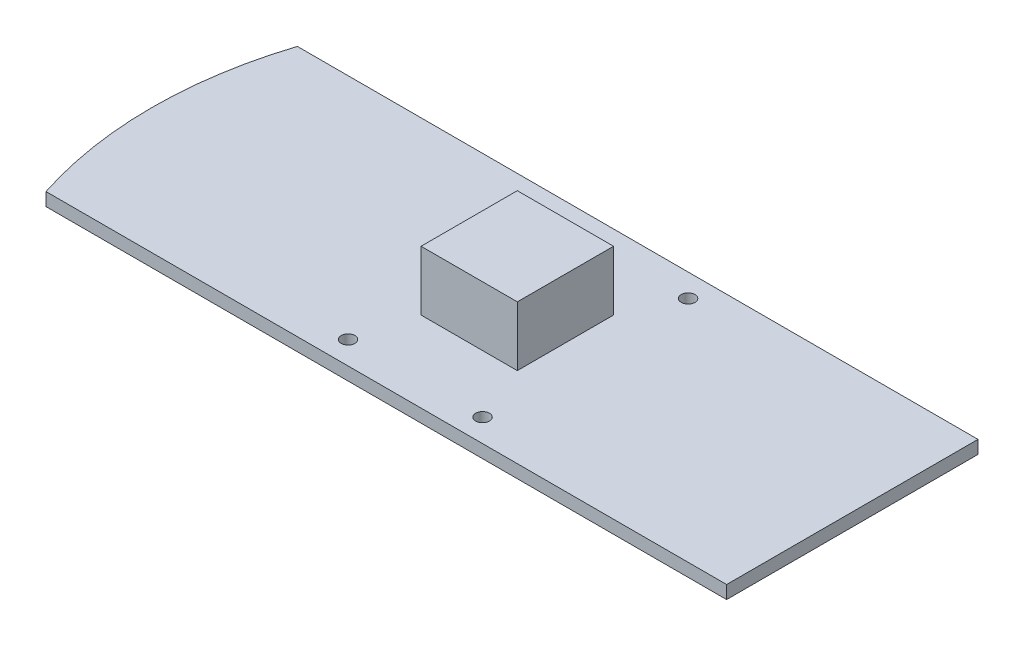
ISO-10303-21;
HEADER;
FILE_DESCRIPTION(('STEP AP214'),'2;1');
FILE_NAME('part.step','',(''),(''),'','','');
FILE_SCHEMA(('AUTOMOTIVE_DESIGN { 1 0 10303 214 1 1 1 1 }'));
ENDSEC;
DATA;
#1=APPLICATION_CONTEXT('core data for automotive mechanical design processes');
#2=APPLICATION_PROTOCOL_DEFINITION('international standard','automotive_design',2000,#1);
#3=PRODUCT_CONTEXT('',#1,'mechanical');
#4=PRODUCT('Part','Part','',(#3));
#5=PRODUCT_RELATED_PRODUCT_CATEGORY('part','',(#4));
#6=PRODUCT_DEFINITION_FORMATION('','',#4);
#7=PRODUCT_DEFINITION_CONTEXT('part definition',#1,'design');
#8=PRODUCT_DEFINITION('design','',#6,#7);
#9=PRODUCT_DEFINITION_SHAPE('','',#8);
#10=(LENGTH_UNIT() NAMED_UNIT(*) SI_UNIT(.MILLI.,.METRE.));
#11=(NAMED_UNIT(*) PLANE_ANGLE_UNIT() SI_UNIT($,.RADIAN.));
#12=(NAMED_UNIT(*) SI_UNIT($,.STERADIAN.) SOLID_ANGLE_UNIT());
#13=UNCERTAINTY_MEASURE_WITH_UNIT(LENGTH_MEASURE(1.E-05),#10,'distance_accuracy_value','');
#14=(GEOMETRIC_REPRESENTATION_CONTEXT(3) GLOBAL_UNCERTAINTY_ASSIGNED_CONTEXT((#13)) GLOBAL_UNIT_ASSIGNED_CONTEXT((#10,
#11,#12)) REPRESENTATION_CONTEXT('',''));
#15=CARTESIAN_POINT('',(0.,0.,0.));
#16=DIRECTION('',(0.,0.,1.));
#17=DIRECTION('',(1.,0.,0.));
#18=AXIS2_PLACEMENT_3D('',#15,#16,#17);
#19=CARTESIAN_POINT('',(0.,2.85,0.));
#20=DIRECTION('',(0.,1.,0.));
#21=DIRECTION('',(0.,0.,1.));
#22=AXIS2_PLACEMENT_3D('',#19,#20,#21);
#23=PLANE('',#22);
#24=CARTESIAN_POINT('',(90.25,2.85,5.));
#25=DIRECTION('',(0.,1.,0.));
#26=DIRECTION('',(0.,0.,1.));
#27=AXIS2_PLACEMENT_3D('',#24,#25,#26);
#28=CIRCLE('',#27,1.5);
#29=CARTESIAN_POINT('',(90.25,2.85,6.5));
#30=VERTEX_POINT('',#29);
#31=EDGE_CURVE('E138',#30,#30,#28,.T.);
#32=ORIENTED_EDGE('',*,*,#31,.F.);
#33=EDGE_LOOP('',(#32));
#34=FACE_BOUND('',#33,.T.);
#35=CARTESIAN_POINT('',(60.9,2.85,5.));
#36=DIRECTION('',(0.,1.,0.));
#37=DIRECTION('',(0.,0.,1.));
#38=AXIS2_PLACEMENT_3D('',#35,#36,#37);
#39=CIRCLE('',#38,1.5);
#40=CARTESIAN_POINT('',(60.9,2.85,6.5));
#41=VERTEX_POINT('',#40);
#42=EDGE_CURVE('E141',#41,#41,#39,.T.);
#43=ORIENTED_EDGE('',*,*,#42,.F.);
#44=EDGE_LOOP('',(#43));
#45=FACE_BOUND('',#44,.T.);
#46=CARTESIAN_POINT('',(60.9,2.85,49.85));
#47=DIRECTION('',(0.,1.,0.));
#48=DIRECTION('',(0.,0.,1.));
#49=AXIS2_PLACEMENT_3D('',#46,#47,#48);
#50=CIRCLE('',#49,1.5);
#51=CARTESIAN_POINT('',(60.9,2.85,51.35));
#52=VERTEX_POINT('',#51);
#53=EDGE_CURVE('E145',#52,#52,#50,.T.);
#54=ORIENTED_EDGE('',*,*,#53,.F.);
#55=EDGE_LOOP('',(#54));
#56=FACE_BOUND('',#55,.T.);
#57=CARTESIAN_POINT('',(90.25,2.85,49.85));
#58=DIRECTION('',(0.,1.,0.));
#59=DIRECTION('',(0.,0.,1.));
#60=AXIS2_PLACEMENT_3D('',#57,#58,#59);
#61=CIRCLE('',#60,1.5);
#62=CARTESIAN_POINT('',(90.25,2.85,51.35));
#63=VERTEX_POINT('',#62);
#64=EDGE_CURVE('E148',#63,#63,#61,.T.);
#65=ORIENTED_EDGE('',*,*,#64,.F.);
#66=EDGE_LOOP('',(#65));
#67=FACE_BOUND('',#66,.T.);
#68=DIRECTION('',(0.,0.,1.));
#69=VECTOR('',#68,1.);
#70=CARTESIAN_POINT('',(148.5,2.85,0.));
#71=LINE('',#70,#69);
#72=CARTESIAN_POINT('',(148.5,2.85,0.));
#73=VERTEX_POINT('',#72);
#74=CARTESIAN_POINT('',(148.5,2.85,54.85));
#75=VERTEX_POINT('',#74);
#76=EDGE_CURVE('E151',#73,#75,#71,.T.);
#77=ORIENTED_EDGE('',*,*,#76,.F.);
#78=DIRECTION('',(1.,0.,0.));
#79=VECTOR('',#78,1.);
#80=CARTESIAN_POINT('',(0.,2.85,0.));
#81=LINE('',#80,#79);
#82=CARTESIAN_POINT('',(0.,2.85,0.));
#83=VERTEX_POINT('',#82);
#84=EDGE_CURVE('E153',#83,#73,#81,.T.);
#85=ORIENTED_EDGE('',*,*,#84,.F.);
#86=CARTESIAN_POINT('',(84.669176061894,2.85,27.425));
#87=DIRECTION('',(0.,1.,0.));
#88=DIRECTION('',(0.,0.,1.));
#89=AXIS2_PLACEMENT_3D('',#86,#87,#88);
#90=CIRCLE('',#89,89.);
#91=CARTESIAN_POINT('',(0.,2.85,54.85));
#92=VERTEX_POINT('',#91);
#93=EDGE_CURVE('E156',#83,#92,#90,.T.);
#94=ORIENTED_EDGE('',*,*,#93,.T.);
#95=DIRECTION('',(1.,0.,0.));
#96=VECTOR('',#95,1.);
#97=CARTESIAN_POINT('',(0.,2.85,54.85));
#98=LINE('',#97,#96);
#99=EDGE_CURVE('E59',#92,#75,#98,.T.);
#100=ORIENTED_EDGE('',*,*,#99,.T.);
#101=EDGE_LOOP('',(#77,#85,#94,#100));
#102=FACE_BOUND('',#101,.T.);
#103=DIRECTION('',(-1.,0.,0.));
#104=VECTOR('',#103,1.);
#105=CARTESIAN_POINT('',(64.2531909400984,2.85,16.2695214263966));
#106=LINE('',#105,#104);
#107=CARTESIAN_POINT('',(85.2531909400984,2.85,16.2695214263966));
#108=VERTEX_POINT('',#107);
#109=CARTESIAN_POINT('',(64.2531909400984,2.85,16.2695214263966));
#110=VERTEX_POINT('',#109);
#111=EDGE_CURVE('E330',#108,#110,#106,.T.);
#112=ORIENTED_EDGE('',*,*,#111,.F.);
#113=DIRECTION('',(0.,0.,-1.));
#114=VECTOR('',#113,1.);
#115=CARTESIAN_POINT('',(85.2531909400984,2.85,37.2695214263966));
#116=LINE('',#115,#114);
#117=CARTESIAN_POINT('',(85.2531909400984,2.85,37.2695214263966));
#118=VERTEX_POINT('',#117);
#119=EDGE_CURVE('E128',#118,#108,#116,.T.);
#120=ORIENTED_EDGE('',*,*,#119,.F.);
#121=DIRECTION('',(1.,0.,0.));
#122=VECTOR('',#121,1.);
#123=CARTESIAN_POINT('',(64.2531909400984,2.85,37.2695214263966));
#124=LINE('',#123,#122);
#125=CARTESIAN_POINT('',(64.2531909400984,2.85,37.2695214263966));
#126=VERTEX_POINT('',#125);
#127=EDGE_CURVE('E124',#126,#118,#124,.T.);
#128=ORIENTED_EDGE('',*,*,#127,.F.);
#129=DIRECTION('',(0.,0.,1.));
#130=VECTOR('',#129,1.);
#131=CARTESIAN_POINT('',(64.2531909400984,2.85,37.2695214263966));
#132=LINE('',#131,#130);
#133=EDGE_CURVE('E327',#110,#126,#132,.T.);
#134=ORIENTED_EDGE('',*,*,#133,.F.);
#135=EDGE_LOOP('',(#112,#120,#128,#134));
#136=FACE_BOUND('',#135,.T.);
#137=ADVANCED_FACE('F35',(#34,#45,#56,#67,#102,#136),#23,.T.);
#138=CARTESIAN_POINT('',(148.5,2.85,0.));
#139=DIRECTION('',(1.,0.,0.));
#140=DIRECTION('',(0.,0.,-1.));
#141=AXIS2_PLACEMENT_3D('',#138,#139,#140);
#142=PLANE('',#141);
#143=DIRECTION('',(0.,0.,1.));
#144=VECTOR('',#143,1.);
#145=CARTESIAN_POINT('',(148.5,0.,0.));
#146=LINE('',#145,#144);
#147=CARTESIAN_POINT('',(148.5,0.,0.));
#148=VERTEX_POINT('',#147);
#149=CARTESIAN_POINT('',(148.5,0.,54.85));
#150=VERTEX_POINT('',#149);
#151=EDGE_CURVE('E167',#148,#150,#146,.T.);
#152=ORIENTED_EDGE('',*,*,#151,.F.);
#153=DIRECTION('',(0.,-1.,0.));
#154=VECTOR('',#153,1.);
#155=CARTESIAN_POINT('',(148.5,2.85,0.));
#156=LINE('',#155,#154);
#157=EDGE_CURVE('E11',#73,#148,#156,.T.);
#158=ORIENTED_EDGE('',*,*,#157,.F.);
#159=ORIENTED_EDGE('',*,*,#76,.T.);
#160=DIRECTION('',(0.,-1.,0.));
#161=VECTOR('',#160,1.);
#162=CARTESIAN_POINT('',(148.5,2.85,54.85));
#163=LINE('',#162,#161);
#164=EDGE_CURVE('E79',#75,#150,#163,.T.);
#165=ORIENTED_EDGE('',*,*,#164,.T.);
#166=EDGE_LOOP('',(#152,#158,#159,#165));
#167=FACE_BOUND('',#166,.T.);
#168=ADVANCED_FACE('F191',(#167),#142,.T.);
#169=CARTESIAN_POINT('',(0.,2.85,0.));
#170=DIRECTION('',(0.,0.,-1.));
#171=DIRECTION('',(-1.,0.,0.));
#172=AXIS2_PLACEMENT_3D('',#169,#170,#171);
#173=PLANE('',#172);
#174=DIRECTION('',(1.,0.,0.));
#175=VECTOR('',#174,1.);
#176=CARTESIAN_POINT('',(0.,0.,0.));
#177=LINE('',#176,#175);
#178=CARTESIAN_POINT('',(0.,0.,0.));
#179=VERTEX_POINT('',#178);
#180=EDGE_CURVE('E170',#179,#148,#177,.T.);
#181=ORIENTED_EDGE('',*,*,#180,.F.);
#182=DIRECTION('',(0.,-1.,0.));
#183=VECTOR('',#182,1.);
#184=CARTESIAN_POINT('',(0.,2.85,0.));
#185=LINE('',#184,#183);
#186=EDGE_CURVE('E43',#83,#179,#185,.T.);
#187=ORIENTED_EDGE('',*,*,#186,.F.);
#188=ORIENTED_EDGE('',*,*,#84,.T.);
#189=ORIENTED_EDGE('',*,*,#157,.T.);
#190=EDGE_LOOP('',(#181,#187,#188,#189));
#191=FACE_BOUND('',#190,.T.);
#192=ADVANCED_FACE('F190',(#191),#173,.T.);
#193=CARTESIAN_POINT('',(84.669176061894,2.85,27.425));
#194=DIRECTION('',(0.,-1.,0.));
#195=DIRECTION('',(0.,0.,-1.));
#196=AXIS2_PLACEMENT_3D('',#193,#194,#195);
#197=CYLINDRICAL_SURFACE('',#196,89.);
#198=CARTESIAN_POINT('',(84.669176061894,0.,27.425));
#199=DIRECTION('',(0.,1.,0.));
#200=DIRECTION('',(0.,0.,1.));
#201=AXIS2_PLACEMENT_3D('',#198,#199,#200);
#202=CIRCLE('',#201,89.);
#203=CARTESIAN_POINT('',(0.,0.,54.85));
#204=VERTEX_POINT('',#203);
#205=EDGE_CURVE('E173',#179,#204,#202,.T.);
#206=ORIENTED_EDGE('',*,*,#205,.T.);
#207=DIRECTION('',(0.,-1.,0.));
#208=VECTOR('',#207,1.);
#209=CARTESIAN_POINT('',(0.,2.85,54.85));
#210=LINE('',#209,#208);
#211=EDGE_CURVE('E178',#92,#204,#210,.T.);
#212=ORIENTED_EDGE('',*,*,#211,.F.);
#213=ORIENTED_EDGE('',*,*,#93,.F.);
#214=ORIENTED_EDGE('',*,*,#186,.T.);
#215=EDGE_LOOP('',(#206,#212,#213,#214));
#216=FACE_BOUND('',#215,.T.);
#217=ADVANCED_FACE('F183',(#216),#197,.T.);
#218=CARTESIAN_POINT('',(90.25,2.85,49.85));
#219=DIRECTION('',(0.,-1.,0.));
#220=DIRECTION('',(0.,0.,-1.));
#221=AXIS2_PLACEMENT_3D('',#218,#219,#220);
#222=CYLINDRICAL_SURFACE('',#221,1.5);
#223=ORIENTED_EDGE('',*,*,#64,.T.);
#224=EDGE_LOOP('',(#223));
#225=FACE_BOUND('',#224,.T.);
#226=CARTESIAN_POINT('',(90.25,0.,49.85));
#227=DIRECTION('',(0.,1.,0.));
#228=DIRECTION('',(0.,0.,1.));
#229=AXIS2_PLACEMENT_3D('',#226,#227,#228);
#230=CIRCLE('',#229,1.5);
#231=CARTESIAN_POINT('',(90.25,0.,51.35));
#232=VERTEX_POINT('',#231);
#233=EDGE_CURVE('E164',#232,#232,#230,.T.);
#234=ORIENTED_EDGE('',*,*,#233,.F.);
#235=EDGE_LOOP('',(#234));
#236=FACE_BOUND('',#235,.T.);
#237=ADVANCED_FACE('F203',(#225,#236),#222,.F.);
#238=CARTESIAN_POINT('',(60.9,2.85,49.85));
#239=DIRECTION('',(0.,-1.,0.));
#240=DIRECTION('',(0.,0.,-1.));
#241=AXIS2_PLACEMENT_3D('',#238,#239,#240);
#242=CYLINDRICAL_SURFACE('',#241,1.5);
#243=ORIENTED_EDGE('',*,*,#53,.T.);
#244=EDGE_LOOP('',(#243));
#245=FACE_BOUND('',#244,.T.);
#246=CARTESIAN_POINT('',(60.9,0.,49.85));
#247=DIRECTION('',(0.,1.,0.));
#248=DIRECTION('',(0.,0.,1.));
#249=AXIS2_PLACEMENT_3D('',#246,#247,#248);
#250=CIRCLE('',#249,1.5);
#251=CARTESIAN_POINT('',(60.9,0.,51.35));
#252=VERTEX_POINT('',#251);
#253=EDGE_CURVE('E161',#252,#252,#250,.T.);
#254=ORIENTED_EDGE('',*,*,#253,.F.);
#255=EDGE_LOOP('',(#254));
#256=FACE_BOUND('',#255,.T.);
#257=ADVANCED_FACE('F206',(#245,#256),#242,.F.);
#258=CARTESIAN_POINT('',(60.9,2.85,5.));
#259=DIRECTION('',(0.,-1.,0.));
#260=DIRECTION('',(0.,0.,-1.));
#261=AXIS2_PLACEMENT_3D('',#258,#259,#260);
#262=CYLINDRICAL_SURFACE('',#261,1.5);
#263=ORIENTED_EDGE('',*,*,#42,.T.);
#264=EDGE_LOOP('',(#263));
#265=FACE_BOUND('',#264,.T.);
#266=CARTESIAN_POINT('',(60.9,0.,5.));
#267=DIRECTION('',(0.,1.,0.));
#268=DIRECTION('',(0.,0.,1.));
#269=AXIS2_PLACEMENT_3D('',#266,#267,#268);
#270=CIRCLE('',#269,1.5);
#271=CARTESIAN_POINT('',(60.9,0.,6.5));
#272=VERTEX_POINT('',#271);
#273=EDGE_CURVE('E133',#272,#272,#270,.T.);
#274=ORIENTED_EDGE('',*,*,#273,.F.);
#275=EDGE_LOOP('',(#274));
#276=FACE_BOUND('',#275,.T.);
#277=ADVANCED_FACE('F209',(#265,#276),#262,.F.);
#278=CARTESIAN_POINT('',(90.25,2.85,5.));
#279=DIRECTION('',(0.,-1.,0.));
#280=DIRECTION('',(0.,0.,-1.));
#281=AXIS2_PLACEMENT_3D('',#278,#279,#280);
#282=CYLINDRICAL_SURFACE('',#281,1.5);
#283=ORIENTED_EDGE('',*,*,#31,.T.);
#284=EDGE_LOOP('',(#283));
#285=FACE_BOUND('',#284,.T.);
#286=CARTESIAN_POINT('',(90.25,0.,5.));
#287=DIRECTION('',(0.,1.,0.));
#288=DIRECTION('',(0.,0.,1.));
#289=AXIS2_PLACEMENT_3D('',#286,#287,#288);
#290=CIRCLE('',#289,1.5);
#291=CARTESIAN_POINT('',(90.25,0.,6.5));
#292=VERTEX_POINT('',#291);
#293=EDGE_CURVE('E130',#292,#292,#290,.T.);
#294=ORIENTED_EDGE('',*,*,#293,.F.);
#295=EDGE_LOOP('',(#294));
#296=FACE_BOUND('',#295,.T.);
#297=ADVANCED_FACE('F37',(#285,#296),#282,.F.);
#298=CARTESIAN_POINT('',(0.,2.85,54.85));
#299=DIRECTION('',(0.,0.,-1.));
#300=DIRECTION('',(-1.,0.,0.));
#301=AXIS2_PLACEMENT_3D('',#298,#299,#300);
#302=PLANE('',#301);
#303=DIRECTION('',(1.,0.,0.));
#304=VECTOR('',#303,1.);
#305=CARTESIAN_POINT('',(0.,0.,54.85));
#306=LINE('',#305,#304);
#307=EDGE_CURVE('E142',#204,#150,#306,.T.);
#308=ORIENTED_EDGE('',*,*,#307,.T.);
#309=ORIENTED_EDGE('',*,*,#164,.F.);
#310=ORIENTED_EDGE('',*,*,#99,.F.);
#311=ORIENTED_EDGE('',*,*,#211,.T.);
#312=EDGE_LOOP('',(#308,#309,#310,#311));
#313=FACE_BOUND('',#312,.T.);
#314=ADVANCED_FACE('F216',(#313),#302,.F.);
#315=CARTESIAN_POINT('',(0.,0.,0.));
#316=DIRECTION('',(0.,1.,0.));
#317=DIRECTION('',(0.,0.,1.));
#318=AXIS2_PLACEMENT_3D('',#315,#316,#317);
#319=PLANE('',#318);
#320=ORIENTED_EDGE('',*,*,#293,.T.);
#321=EDGE_LOOP('',(#320));
#322=FACE_BOUND('',#321,.T.);
#323=ORIENTED_EDGE('',*,*,#273,.T.);
#324=EDGE_LOOP('',(#323));
#325=FACE_BOUND('',#324,.T.);
#326=ORIENTED_EDGE('',*,*,#253,.T.);
#327=EDGE_LOOP('',(#326));
#328=FACE_BOUND('',#327,.T.);
#329=ORIENTED_EDGE('',*,*,#233,.T.);
#330=EDGE_LOOP('',(#329));
#331=FACE_BOUND('',#330,.T.);
#332=ORIENTED_EDGE('',*,*,#151,.T.);
#333=ORIENTED_EDGE('',*,*,#307,.F.);
#334=ORIENTED_EDGE('',*,*,#205,.F.);
#335=ORIENTED_EDGE('',*,*,#180,.T.);
#336=EDGE_LOOP('',(#332,#333,#334,#335));
#337=FACE_BOUND('',#336,.T.);
#338=ADVANCED_FACE('F189',(#322,#325,#328,#331,#337),#319,.F.);
#339=CARTESIAN_POINT('',(85.2531909400984,15.85,37.2695214263966));
#340=DIRECTION('',(-1.,0.,0.));
#341=DIRECTION('',(0.,0.,1.));
#342=AXIS2_PLACEMENT_3D('',#339,#340,#341);
#343=PLANE('',#342);
#344=ORIENTED_EDGE('',*,*,#119,.T.);
#345=DIRECTION('',(0.,-1.,0.));
#346=VECTOR('',#345,1.);
#347=CARTESIAN_POINT('',(85.2531909400984,15.85,16.2695214263966));
#348=LINE('',#347,#346);
#349=CARTESIAN_POINT('',(85.2531909400984,15.85,16.2695214263966));
#350=VERTEX_POINT('',#349);
#351=EDGE_CURVE('E109',#350,#108,#348,.T.);
#352=ORIENTED_EDGE('',*,*,#351,.F.);
#353=DIRECTION('',(0.,0.,-1.));
#354=VECTOR('',#353,1.);
#355=CARTESIAN_POINT('',(85.2531909400984,15.85,37.2695214263966));
#356=LINE('',#355,#354);
#357=CARTESIAN_POINT('',(85.2531909400984,15.85,37.2695214263966));
#358=VERTEX_POINT('',#357);
#359=EDGE_CURVE('E116',#358,#350,#356,.T.);
#360=ORIENTED_EDGE('',*,*,#359,.F.);
#361=DIRECTION('',(0.,-1.,0.));
#362=VECTOR('',#361,1.);
#363=CARTESIAN_POINT('',(85.2531909400984,15.85,37.2695214263966));
#364=LINE('',#363,#362);
#365=EDGE_CURVE('E324',#358,#118,#364,.T.);
#366=ORIENTED_EDGE('',*,*,#365,.T.);
#367=EDGE_LOOP('',(#344,#352,#360,#366));
#368=FACE_BOUND('',#367,.T.);
#369=ADVANCED_FACE('F126',(#368),#343,.F.);
#370=CARTESIAN_POINT('',(64.2531909400984,15.85,16.2695214263966));
#371=DIRECTION('',(0.,0.,1.));
#372=DIRECTION('',(1.,0.,0.));
#373=AXIS2_PLACEMENT_3D('',#370,#371,#372);
#374=PLANE('',#373);
#375=ORIENTED_EDGE('',*,*,#111,.T.);
#376=DIRECTION('',(0.,-1.,0.));
#377=VECTOR('',#376,1.);
#378=CARTESIAN_POINT('',(64.2531909400984,15.85,16.2695214263966));
#379=LINE('',#378,#377);
#380=CARTESIAN_POINT('',(64.2531909400984,15.85,16.2695214263966));
#381=VERTEX_POINT('',#380);
#382=EDGE_CURVE('E112',#381,#110,#379,.T.);
#383=ORIENTED_EDGE('',*,*,#382,.F.);
#384=DIRECTION('',(-1.,0.,0.));
#385=VECTOR('',#384,1.);
#386=CARTESIAN_POINT('',(64.2531909400984,15.85,16.2695214263966));
#387=LINE('',#386,#385);
#388=EDGE_CURVE('E105',#350,#381,#387,.T.);
#389=ORIENTED_EDGE('',*,*,#388,.F.);
#390=ORIENTED_EDGE('',*,*,#351,.T.);
#391=EDGE_LOOP('',(#375,#383,#389,#390));
#392=FACE_BOUND('',#391,.T.);
#393=ADVANCED_FACE('F107',(#392),#374,.F.);
#394=CARTESIAN_POINT('',(64.2531909400984,15.85,37.2695214263966));
#395=DIRECTION('',(1.,0.,0.));
#396=DIRECTION('',(0.,0.,-1.));
#397=AXIS2_PLACEMENT_3D('',#394,#395,#396);
#398=PLANE('',#397);
#399=ORIENTED_EDGE('',*,*,#133,.T.);
#400=DIRECTION('',(0.,-1.,0.));
#401=VECTOR('',#400,1.);
#402=CARTESIAN_POINT('',(64.2531909400984,15.85,37.2695214263966));
#403=LINE('',#402,#401);
#404=CARTESIAN_POINT('',(64.2531909400984,15.85,37.2695214263966));
#405=VERTEX_POINT('',#404);
#406=EDGE_CURVE('E50',#405,#126,#403,.T.);
#407=ORIENTED_EDGE('',*,*,#406,.F.);
#408=DIRECTION('',(0.,0.,1.));
#409=VECTOR('',#408,1.);
#410=CARTESIAN_POINT('',(64.2531909400984,15.85,37.2695214263966));
#411=LINE('',#410,#409);
#412=EDGE_CURVE('E115',#381,#405,#411,.T.);
#413=ORIENTED_EDGE('',*,*,#412,.F.);
#414=ORIENTED_EDGE('',*,*,#382,.T.);
#415=EDGE_LOOP('',(#399,#407,#413,#414));
#416=FACE_BOUND('',#415,.T.);
#417=ADVANCED_FACE('F293',(#416),#398,.F.);
#418=CARTESIAN_POINT('',(64.2531909400984,15.85,37.2695214263966));
#419=DIRECTION('',(0.,0.,-1.));
#420=DIRECTION('',(-1.,0.,0.));
#421=AXIS2_PLACEMENT_3D('',#418,#419,#420);
#422=PLANE('',#421);
#423=ORIENTED_EDGE('',*,*,#127,.T.);
#424=ORIENTED_EDGE('',*,*,#365,.F.);
#425=DIRECTION('',(1.,0.,0.));
#426=VECTOR('',#425,1.);
#427=CARTESIAN_POINT('',(64.2531909400984,15.85,37.2695214263966));
#428=LINE('',#427,#426);
#429=EDGE_CURVE('E120',#405,#358,#428,.T.);
#430=ORIENTED_EDGE('',*,*,#429,.F.);
#431=ORIENTED_EDGE('',*,*,#406,.T.);
#432=EDGE_LOOP('',(#423,#424,#430,#431));
#433=FACE_BOUND('',#432,.T.);
#434=ADVANCED_FACE('F302',(#433),#422,.F.);
#435=CARTESIAN_POINT('',(0.,15.85,0.));
#436=DIRECTION('',(0.,-1.,0.));
#437=DIRECTION('',(0.,0.,-1.));
#438=AXIS2_PLACEMENT_3D('',#435,#436,#437);
#439=PLANE('',#438);
#440=ORIENTED_EDGE('',*,*,#359,.T.);
#441=ORIENTED_EDGE('',*,*,#388,.T.);
#442=ORIENTED_EDGE('',*,*,#412,.T.);
#443=ORIENTED_EDGE('',*,*,#429,.T.);
#444=EDGE_LOOP('',(#440,#441,#442,#443));
#445=FACE_BOUND('',#444,.T.);
#446=ADVANCED_FACE('F119',(#445),#439,.F.);
#447=CLOSED_SHELL('',(#137,#168,#192,#217,#237,#257,#277,#297,#314,#338,#369,#393,#417,#434,#446));
#448=MANIFOLD_SOLID_BREP('B2',#447);
#449=ADVANCED_BREP_SHAPE_REPRESENTATION('',(#18,#448),#14);
#450=SHAPE_DEFINITION_REPRESENTATION(#9,#449);
ENDSEC;
END-ISO-10303-21;
